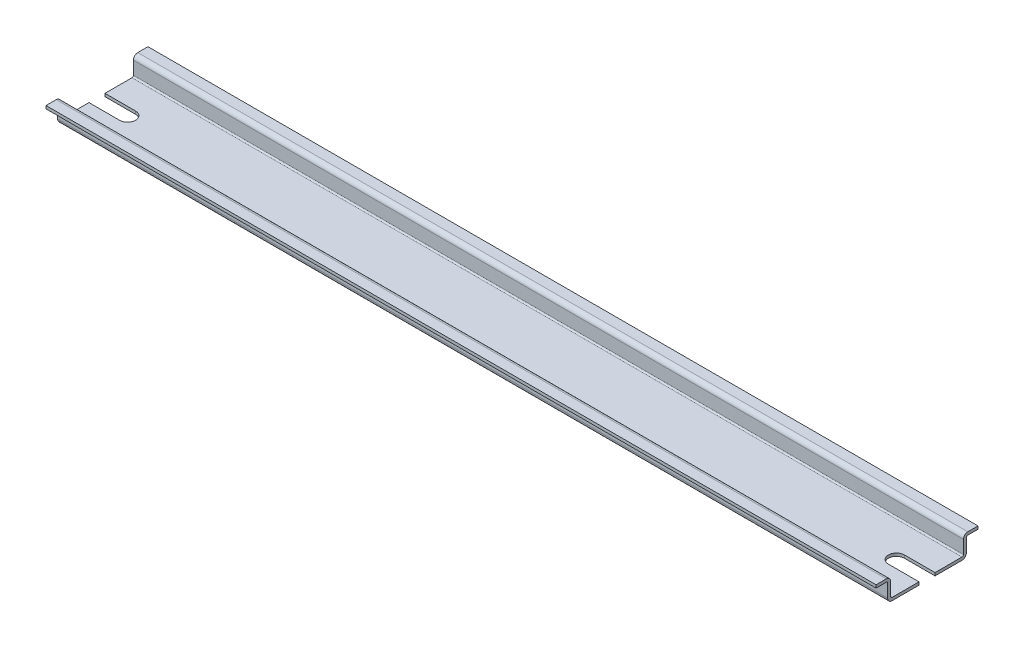
ISO-10303-21;
HEADER;
FILE_DESCRIPTION(('STEP AP214'),'2;1');
FILE_NAME('part.step','',(''),(''),'','','');
FILE_SCHEMA(('AUTOMOTIVE_DESIGN { 1 0 10303 214 1 1 1 1 }'));
ENDSEC;
DATA;
#1=APPLICATION_CONTEXT('core data for automotive mechanical design processes');
#2=APPLICATION_PROTOCOL_DEFINITION('international standard','automotive_design',2000,#1);
#3=PRODUCT_CONTEXT('',#1,'mechanical');
#4=PRODUCT('Part','Part','',(#3));
#5=PRODUCT_RELATED_PRODUCT_CATEGORY('part','',(#4));
#6=PRODUCT_DEFINITION_FORMATION('','',#4);
#7=PRODUCT_DEFINITION_CONTEXT('part definition',#1,'design');
#8=PRODUCT_DEFINITION('design','',#6,#7);
#9=PRODUCT_DEFINITION_SHAPE('','',#8);
#10=(LENGTH_UNIT() NAMED_UNIT(*) SI_UNIT(.MILLI.,.METRE.));
#11=(NAMED_UNIT(*) PLANE_ANGLE_UNIT() SI_UNIT($,.RADIAN.));
#12=(NAMED_UNIT(*) SI_UNIT($,.STERADIAN.) SOLID_ANGLE_UNIT());
#13=UNCERTAINTY_MEASURE_WITH_UNIT(LENGTH_MEASURE(1.E-05),#10,'distance_accuracy_value','');
#14=(GEOMETRIC_REPRESENTATION_CONTEXT(3) GLOBAL_UNCERTAINTY_ASSIGNED_CONTEXT((#13)) GLOBAL_UNIT_ASSIGNED_CONTEXT((#10,
#11,#12)) REPRESENTATION_CONTEXT('',''));
#15=CARTESIAN_POINT('',(0.,0.,0.));
#16=DIRECTION('',(0.,0.,1.));
#17=DIRECTION('',(1.,0.,0.));
#18=AXIS2_PLACEMENT_3D('',#15,#16,#17);
#19=CARTESIAN_POINT('',(-142.5,7.5,17.5));
#20=DIRECTION('',(0.,0.,1.));
#21=DIRECTION('',(1.,0.,0.));
#22=AXIS2_PLACEMENT_3D('',#19,#20,#21);
#23=PLANE('',#22);
#24=DIRECTION('',(1.,0.,0.));
#25=VECTOR('',#24,1.);
#26=CARTESIAN_POINT('',(-142.5,7.5,17.5));
#27=LINE('',#26,#25);
#28=CARTESIAN_POINT('',(-142.5,7.5,17.5));
#29=VERTEX_POINT('',#28);
#30=CARTESIAN_POINT('',(142.5,7.5,17.5));
#31=VERTEX_POINT('',#30);
#32=EDGE_CURVE('E392',#29,#31,#27,.T.);
#33=ORIENTED_EDGE('',*,*,#32,.F.);
#34=DIRECTION('',(0.,1.,0.));
#35=VECTOR('',#34,1.);
#36=CARTESIAN_POINT('',(-142.5,7.5,17.5));
#37=LINE('',#36,#35);
#38=CARTESIAN_POINT('',(-142.5,6.5,17.5));
#39=VERTEX_POINT('',#38);
#40=EDGE_CURVE('E165',#29,#39,#37,.F.);
#41=ORIENTED_EDGE('',*,*,#40,.T.);
#42=DIRECTION('',(1.,0.,0.));
#43=VECTOR('',#42,1.);
#44=CARTESIAN_POINT('',(-142.5,6.5,17.5));
#45=LINE('',#44,#43);
#46=CARTESIAN_POINT('',(142.5,6.5,17.5));
#47=VERTEX_POINT('',#46);
#48=EDGE_CURVE('E382',#47,#39,#45,.F.);
#49=ORIENTED_EDGE('',*,*,#48,.F.);
#50=DIRECTION('',(0.,1.,0.));
#51=VECTOR('',#50,1.);
#52=CARTESIAN_POINT('',(142.5,7.5,17.5));
#53=LINE('',#52,#51);
#54=EDGE_CURVE('E412',#47,#31,#53,.T.);
#55=ORIENTED_EDGE('',*,*,#54,.T.);
#56=EDGE_LOOP('',(#33,#41,#49,#55));
#57=FACE_BOUND('',#56,.T.);
#58=ADVANCED_FACE('F16',(#57),#23,.T.);
#59=CARTESIAN_POINT('',(-142.5,6.,14.));
#60=DIRECTION('',(-1.,0.,0.));
#61=DIRECTION('',(0.,0.,1.));
#62=AXIS2_PLACEMENT_3D('',#59,#60,#61);
#63=CYLINDRICAL_SURFACE('',#62,0.5);
#64=CARTESIAN_POINT('',(142.5,6.,14.));
#65=DIRECTION('',(-1.,0.,0.));
#66=DIRECTION('',(0.,0.,1.));
#67=AXIS2_PLACEMENT_3D('',#64,#65,#66);
#68=CIRCLE('',#67,0.5);
#69=CARTESIAN_POINT('',(142.5,6.5,14.));
#70=VERTEX_POINT('',#69);
#71=CARTESIAN_POINT('',(142.5,6.,13.5));
#72=VERTEX_POINT('',#71);
#73=EDGE_CURVE('E454',#70,#72,#68,.T.);
#74=ORIENTED_EDGE('',*,*,#73,.F.);
#75=DIRECTION('',(1.,0.,0.));
#76=VECTOR('',#75,1.);
#77=CARTESIAN_POINT('',(-142.5,6.5,14.));
#78=LINE('',#77,#76);
#79=CARTESIAN_POINT('',(-142.5,6.5,14.));
#80=VERTEX_POINT('',#79);
#81=EDGE_CURVE('E383',#80,#70,#78,.T.);
#82=ORIENTED_EDGE('',*,*,#81,.F.);
#83=CARTESIAN_POINT('',(-142.5,6.,14.));
#84=DIRECTION('',(-1.,0.,0.));
#85=DIRECTION('',(0.,0.,1.));
#86=AXIS2_PLACEMENT_3D('',#83,#84,#85);
#87=CIRCLE('',#86,0.5);
#88=CARTESIAN_POINT('',(-142.5,6.,13.5));
#89=VERTEX_POINT('',#88);
#90=EDGE_CURVE('E19',#89,#80,#87,.F.);
#91=ORIENTED_EDGE('',*,*,#90,.F.);
#92=DIRECTION('',(1.,0.,0.));
#93=VECTOR('',#92,1.);
#94=CARTESIAN_POINT('',(-142.5,6.,13.5));
#95=LINE('',#94,#93);
#96=EDGE_CURVE('E380',#72,#89,#95,.F.);
#97=ORIENTED_EDGE('',*,*,#96,.F.);
#98=EDGE_LOOP('',(#74,#82,#91,#97));
#99=FACE_BOUND('',#98,.T.);
#100=ADVANCED_FACE('F459',(#99),#63,.F.);
#101=CARTESIAN_POINT('',(-142.5,6.,-14.));
#102=DIRECTION('',(-1.,0.,0.));
#103=DIRECTION('',(0.,0.,1.));
#104=AXIS2_PLACEMENT_3D('',#101,#102,#103);
#105=CYLINDRICAL_SURFACE('',#104,0.5);
#106=CARTESIAN_POINT('',(142.5,6.,-14.));
#107=DIRECTION('',(-1.,0.,0.));
#108=DIRECTION('',(0.,0.,1.));
#109=AXIS2_PLACEMENT_3D('',#106,#107,#108);
#110=CIRCLE('',#109,0.5);
#111=CARTESIAN_POINT('',(142.5,6.,-13.5));
#112=VERTEX_POINT('',#111);
#113=CARTESIAN_POINT('',(142.5,6.5,-14.));
#114=VERTEX_POINT('',#113);
#115=EDGE_CURVE('E227',#112,#114,#110,.T.);
#116=ORIENTED_EDGE('',*,*,#115,.F.);
#117=DIRECTION('',(-1.,0.,0.));
#118=VECTOR('',#117,1.);
#119=CARTESIAN_POINT('',(-142.5,6.,-13.5));
#120=LINE('',#119,#118);
#121=CARTESIAN_POINT('',(-142.5,6.,-13.5));
#122=VERTEX_POINT('',#121);
#123=EDGE_CURVE('E362',#122,#112,#120,.F.);
#124=ORIENTED_EDGE('',*,*,#123,.F.);
#125=CARTESIAN_POINT('',(-142.5,6.,-14.));
#126=DIRECTION('',(-1.,0.,0.));
#127=DIRECTION('',(0.,0.,1.));
#128=AXIS2_PLACEMENT_3D('',#125,#126,#127);
#129=CIRCLE('',#128,0.5);
#130=CARTESIAN_POINT('',(-142.5,6.5,-14.));
#131=VERTEX_POINT('',#130);
#132=EDGE_CURVE('E453',#131,#122,#129,.F.);
#133=ORIENTED_EDGE('',*,*,#132,.F.);
#134=DIRECTION('',(1.,0.,0.));
#135=VECTOR('',#134,1.);
#136=CARTESIAN_POINT('',(-142.5,6.5,-14.));
#137=LINE('',#136,#135);
#138=EDGE_CURVE('E235',#114,#131,#137,.F.);
#139=ORIENTED_EDGE('',*,*,#138,.F.);
#140=EDGE_LOOP('',(#116,#124,#133,#139));
#141=FACE_BOUND('',#140,.T.);
#142=ADVANCED_FACE('F575',(#141),#105,.F.);
#143=CARTESIAN_POINT('',(-142.5,6.5,-17.5));
#144=DIRECTION('',(0.,0.,-1.));
#145=DIRECTION('',(-1.,0.,0.));
#146=AXIS2_PLACEMENT_3D('',#143,#144,#145);
#147=PLANE('',#146);
#148=DIRECTION('',(1.,0.,0.));
#149=VECTOR('',#148,1.);
#150=CARTESIAN_POINT('',(-142.5,6.5,-17.5));
#151=LINE('',#150,#149);
#152=CARTESIAN_POINT('',(-142.5,6.5,-17.5));
#153=VERTEX_POINT('',#152);
#154=CARTESIAN_POINT('',(142.5,6.5,-17.5));
#155=VERTEX_POINT('',#154);
#156=EDGE_CURVE('E355',#153,#155,#151,.T.);
#157=ORIENTED_EDGE('',*,*,#156,.F.);
#158=DIRECTION('',(0.,1.,0.));
#159=VECTOR('',#158,1.);
#160=CARTESIAN_POINT('',(-142.5,6.5,-17.5));
#161=LINE('',#160,#159);
#162=CARTESIAN_POINT('',(-142.5,7.5,-17.5));
#163=VERTEX_POINT('',#162);
#164=EDGE_CURVE('E226',#153,#163,#161,.T.);
#165=ORIENTED_EDGE('',*,*,#164,.T.);
#166=DIRECTION('',(1.,0.,0.));
#167=VECTOR('',#166,1.);
#168=CARTESIAN_POINT('',(-142.5,7.5,-17.5));
#169=LINE('',#168,#167);
#170=CARTESIAN_POINT('',(142.5,7.5,-17.5));
#171=VERTEX_POINT('',#170);
#172=EDGE_CURVE('E230',#171,#163,#169,.F.);
#173=ORIENTED_EDGE('',*,*,#172,.F.);
#174=DIRECTION('',(0.,1.,0.));
#175=VECTOR('',#174,1.);
#176=CARTESIAN_POINT('',(142.5,6.5,-17.5));
#177=LINE('',#176,#175);
#178=EDGE_CURVE('E214',#171,#155,#177,.F.);
#179=ORIENTED_EDGE('',*,*,#178,.T.);
#180=EDGE_LOOP('',(#157,#165,#173,#179));
#181=FACE_BOUND('',#180,.T.);
#182=ADVANCED_FACE('F231',(#181),#147,.T.);
#183=CARTESIAN_POINT('',(-142.5,1.5,12.5));
#184=DIRECTION('',(0.,0.,-1.));
#185=DIRECTION('',(-1.,0.,0.));
#186=AXIS2_PLACEMENT_3D('',#183,#184,#185);
#187=PLANE('',#186);
#188=DIRECTION('',(-1.,0.,0.));
#189=VECTOR('',#188,1.);
#190=CARTESIAN_POINT('',(-142.5,1.5,12.5));
#191=LINE('',#190,#189);
#192=CARTESIAN_POINT('',(142.5,1.5,12.5));
#193=VERTEX_POINT('',#192);
#194=CARTESIAN_POINT('',(-142.5,1.5,12.5));
#195=VERTEX_POINT('',#194);
#196=EDGE_CURVE('E400',#193,#195,#191,.T.);
#197=ORIENTED_EDGE('',*,*,#196,.T.);
#198=DIRECTION('',(0.,1.,0.));
#199=VECTOR('',#198,1.);
#200=CARTESIAN_POINT('',(-142.5,0.,12.5));
#201=LINE('',#200,#199);
#202=CARTESIAN_POINT('',(-142.5,6.,12.5));
#203=VERTEX_POINT('',#202);
#204=EDGE_CURVE('E326',#195,#203,#201,.T.);
#205=ORIENTED_EDGE('',*,*,#204,.T.);
#206=DIRECTION('',(-1.,0.,0.));
#207=VECTOR('',#206,1.);
#208=CARTESIAN_POINT('',(-142.5,6.,12.5));
#209=LINE('',#208,#207);
#210=CARTESIAN_POINT('',(142.5,6.,12.5));
#211=VERTEX_POINT('',#210);
#212=EDGE_CURVE('E395',#211,#203,#209,.T.);
#213=ORIENTED_EDGE('',*,*,#212,.F.);
#214=DIRECTION('',(0.,1.,0.));
#215=VECTOR('',#214,1.);
#216=CARTESIAN_POINT('',(142.5,0.,12.5));
#217=LINE('',#216,#215);
#218=EDGE_CURVE('E300',#193,#211,#217,.T.);
#219=ORIENTED_EDGE('',*,*,#218,.F.);
#220=EDGE_LOOP('',(#197,#205,#213,#219));
#221=FACE_BOUND('',#220,.T.);
#222=ADVANCED_FACE('F487',(#221),#187,.T.);
#223=CARTESIAN_POINT('',(-142.5,6.,14.));
#224=DIRECTION('',(-1.,0.,0.));
#225=DIRECTION('',(0.,0.,1.));
#226=AXIS2_PLACEMENT_3D('',#223,#224,#225);
#227=CYLINDRICAL_SURFACE('',#226,1.5);
#228=ORIENTED_EDGE('',*,*,#212,.T.);
#229=CARTESIAN_POINT('',(-142.5,6.,14.));
#230=DIRECTION('',(-1.,0.,0.));
#231=DIRECTION('',(0.,0.,1.));
#232=AXIS2_PLACEMENT_3D('',#229,#230,#231);
#233=CIRCLE('',#232,1.5);
#234=CARTESIAN_POINT('',(-142.5,7.5,14.));
#235=VERTEX_POINT('',#234);
#236=EDGE_CURVE('E323',#203,#235,#233,.F.);
#237=ORIENTED_EDGE('',*,*,#236,.T.);
#238=DIRECTION('',(1.,0.,0.));
#239=VECTOR('',#238,1.);
#240=CARTESIAN_POINT('',(-142.5,7.5,14.));
#241=LINE('',#240,#239);
#242=CARTESIAN_POINT('',(142.5,7.5,14.));
#243=VERTEX_POINT('',#242);
#244=EDGE_CURVE('E386',#243,#235,#241,.F.);
#245=ORIENTED_EDGE('',*,*,#244,.F.);
#246=CARTESIAN_POINT('',(142.5,6.,14.));
#247=DIRECTION('',(-1.,0.,0.));
#248=DIRECTION('',(0.,0.,1.));
#249=AXIS2_PLACEMENT_3D('',#246,#247,#248);
#250=CIRCLE('',#249,1.5);
#251=EDGE_CURVE('E297',#211,#243,#250,.F.);
#252=ORIENTED_EDGE('',*,*,#251,.F.);
#253=EDGE_LOOP('',(#228,#237,#245,#252));
#254=FACE_BOUND('',#253,.T.);
#255=ADVANCED_FACE('F491',(#254),#227,.T.);
#256=CARTESIAN_POINT('',(-142.5,7.5,14.));
#257=DIRECTION('',(0.,1.,0.));
#258=DIRECTION('',(0.,0.,1.));
#259=AXIS2_PLACEMENT_3D('',#256,#257,#258);
#260=PLANE('',#259);
#261=ORIENTED_EDGE('',*,*,#244,.T.);
#262=DIRECTION('',(0.,0.,-1.));
#263=VECTOR('',#262,1.);
#264=CARTESIAN_POINT('',(-142.5,7.5,0.));
#265=LINE('',#264,#263);
#266=EDGE_CURVE('E318',#235,#29,#265,.F.);
#267=ORIENTED_EDGE('',*,*,#266,.T.);
#268=ORIENTED_EDGE('',*,*,#32,.T.);
#269=DIRECTION('',(0.,0.,-1.));
#270=VECTOR('',#269,1.);
#271=CARTESIAN_POINT('',(142.5,7.5,0.));
#272=LINE('',#271,#270);
#273=EDGE_CURVE('E292',#243,#31,#272,.F.);
#274=ORIENTED_EDGE('',*,*,#273,.F.);
#275=EDGE_LOOP('',(#261,#267,#268,#274));
#276=FACE_BOUND('',#275,.T.);
#277=ADVANCED_FACE('F494',(#276),#260,.T.);
#278=CARTESIAN_POINT('',(-142.5,6.5,17.5));
#279=DIRECTION('',(0.,-1.,0.));
#280=DIRECTION('',(0.,0.,-1.));
#281=AXIS2_PLACEMENT_3D('',#278,#279,#280);
#282=PLANE('',#281);
#283=ORIENTED_EDGE('',*,*,#48,.T.);
#284=DIRECTION('',(0.,0.,-1.));
#285=VECTOR('',#284,1.);
#286=CARTESIAN_POINT('',(-142.5,6.5,0.));
#287=LINE('',#286,#285);
#288=EDGE_CURVE('E315',#39,#80,#287,.T.);
#289=ORIENTED_EDGE('',*,*,#288,.T.);
#290=ORIENTED_EDGE('',*,*,#81,.T.);
#291=DIRECTION('',(0.,0.,-1.));
#292=VECTOR('',#291,1.);
#293=CARTESIAN_POINT('',(142.5,6.5,0.));
#294=LINE('',#293,#292);
#295=EDGE_CURVE('E289',#47,#70,#294,.T.);
#296=ORIENTED_EDGE('',*,*,#295,.F.);
#297=EDGE_LOOP('',(#283,#289,#290,#296));
#298=FACE_BOUND('',#297,.T.);
#299=ADVANCED_FACE('F497',(#298),#282,.T.);
#300=CARTESIAN_POINT('',(-142.5,6.,13.5));
#301=DIRECTION('',(0.,0.,1.));
#302=DIRECTION('',(1.,0.,0.));
#303=AXIS2_PLACEMENT_3D('',#300,#301,#302);
#304=PLANE('',#303);
#305=ORIENTED_EDGE('',*,*,#96,.T.);
#306=DIRECTION('',(0.,1.,0.));
#307=VECTOR('',#306,1.);
#308=CARTESIAN_POINT('',(-142.5,0.,13.5));
#309=LINE('',#308,#307);
#310=CARTESIAN_POINT('',(-142.5,1.5,13.5));
#311=VERTEX_POINT('',#310);
#312=EDGE_CURVE('E312',#89,#311,#309,.F.);
#313=ORIENTED_EDGE('',*,*,#312,.T.);
#314=DIRECTION('',(-1.,0.,0.));
#315=VECTOR('',#314,1.);
#316=CARTESIAN_POINT('',(-142.5,1.5,13.5));
#317=LINE('',#316,#315);
#318=CARTESIAN_POINT('',(142.5,1.5,13.5));
#319=VERTEX_POINT('',#318);
#320=EDGE_CURVE('E377',#319,#311,#317,.T.);
#321=ORIENTED_EDGE('',*,*,#320,.F.);
#322=DIRECTION('',(0.,1.,0.));
#323=VECTOR('',#322,1.);
#324=CARTESIAN_POINT('',(142.5,0.,13.5));
#325=LINE('',#324,#323);
#326=EDGE_CURVE('E286',#72,#319,#325,.F.);
#327=ORIENTED_EDGE('',*,*,#326,.F.);
#328=EDGE_LOOP('',(#305,#313,#321,#327));
#329=FACE_BOUND('',#328,.T.);
#330=ADVANCED_FACE('F461',(#329),#304,.T.);
#331=CARTESIAN_POINT('',(-142.5,1.5,12.));
#332=DIRECTION('',(-1.,0.,0.));
#333=DIRECTION('',(0.,0.,1.));
#334=AXIS2_PLACEMENT_3D('',#331,#332,#333);
#335=CYLINDRICAL_SURFACE('',#334,1.5);
#336=ORIENTED_EDGE('',*,*,#320,.T.);
#337=CARTESIAN_POINT('',(-142.5,1.5,12.));
#338=DIRECTION('',(-1.,0.,0.));
#339=DIRECTION('',(0.,0.,1.));
#340=AXIS2_PLACEMENT_3D('',#337,#338,#339);
#341=CIRCLE('',#340,1.5);
#342=CARTESIAN_POINT('',(-142.5,0.,12.));
#343=VERTEX_POINT('',#342);
#344=EDGE_CURVE('E314',#311,#343,#341,.F.);
#345=ORIENTED_EDGE('',*,*,#344,.T.);
#346=DIRECTION('',(1.,0.,0.));
#347=VECTOR('',#346,1.);
#348=CARTESIAN_POINT('',(-142.5,0.,12.));
#349=LINE('',#348,#347);
#350=CARTESIAN_POINT('',(142.5,0.,12.));
#351=VERTEX_POINT('',#350);
#352=EDGE_CURVE('E368',#351,#343,#349,.F.);
#353=ORIENTED_EDGE('',*,*,#352,.F.);
#354=CARTESIAN_POINT('',(142.5,1.5,12.));
#355=DIRECTION('',(-1.,0.,0.));
#356=DIRECTION('',(0.,0.,1.));
#357=AXIS2_PLACEMENT_3D('',#354,#355,#356);
#358=CIRCLE('',#357,1.5);
#359=EDGE_CURVE('E283',#319,#351,#358,.F.);
#360=ORIENTED_EDGE('',*,*,#359,.F.);
#361=EDGE_LOOP('',(#336,#345,#353,#360));
#362=FACE_BOUND('',#361,.T.);
#363=ADVANCED_FACE('F465',(#362),#335,.T.);
#364=CARTESIAN_POINT('',(-142.5,0.,12.));
#365=DIRECTION('',(0.,-1.,0.));
#366=DIRECTION('',(0.,0.,-1.));
#367=AXIS2_PLACEMENT_3D('',#364,#365,#366);
#368=PLANE('',#367);
#369=ORIENTED_EDGE('',*,*,#352,.T.);
#370=DIRECTION('',(0.,0.,-1.));
#371=VECTOR('',#370,1.);
#372=CARTESIAN_POINT('',(-142.5,0.,0.));
#373=LINE('',#372,#371);
#374=CARTESIAN_POINT('',(-142.5,0.,2.75));
#375=VERTEX_POINT('',#374);
#376=EDGE_CURVE('E328',#343,#375,#373,.T.);
#377=ORIENTED_EDGE('',*,*,#376,.T.);
#378=DIRECTION('',(1.,0.,0.));
#379=VECTOR('',#378,1.);
#380=CARTESIAN_POINT('',(-132.,0.,2.75));
#381=LINE('',#380,#379);
#382=CARTESIAN_POINT('',(-132.,0.,2.75));
#383=VERTEX_POINT('',#382);
#384=EDGE_CURVE('E336',#375,#383,#381,.T.);
#385=ORIENTED_EDGE('',*,*,#384,.T.);
#386=CARTESIAN_POINT('',(-132.,0.,0.));
#387=DIRECTION('',(0.,1.,0.));
#388=DIRECTION('',(0.,0.,1.));
#389=AXIS2_PLACEMENT_3D('',#386,#387,#388);
#390=CIRCLE('',#389,2.75);
#391=CARTESIAN_POINT('',(-132.,0.,-2.75));
#392=VERTEX_POINT('',#391);
#393=EDGE_CURVE('E339',#383,#392,#390,.T.);
#394=ORIENTED_EDGE('',*,*,#393,.T.);
#395=DIRECTION('',(-1.,0.,0.));
#396=VECTOR('',#395,1.);
#397=CARTESIAN_POINT('',(-142.5,0.,-2.75));
#398=LINE('',#397,#396);
#399=CARTESIAN_POINT('',(-142.5,0.,-2.75));
#400=VERTEX_POINT('',#399);
#401=EDGE_CURVE('E340',#392,#400,#398,.T.);
#402=ORIENTED_EDGE('',*,*,#401,.T.);
#403=DIRECTION('',(0.,0.,-1.));
#404=VECTOR('',#403,1.);
#405=CARTESIAN_POINT('',(-142.5,0.,0.));
#406=LINE('',#405,#404);
#407=CARTESIAN_POINT('',(-142.5,0.,-12.));
#408=VERTEX_POINT('',#407);
#409=EDGE_CURVE('E436',#400,#408,#406,.T.);
#410=ORIENTED_EDGE('',*,*,#409,.T.);
#411=DIRECTION('',(-1.,0.,0.));
#412=VECTOR('',#411,1.);
#413=CARTESIAN_POINT('',(-142.5,0.,-12.));
#414=LINE('',#413,#412);
#415=CARTESIAN_POINT('',(142.5,0.,-12.));
#416=VERTEX_POINT('',#415);
#417=EDGE_CURVE('E365',#416,#408,#414,.T.);
#418=ORIENTED_EDGE('',*,*,#417,.F.);
#419=DIRECTION('',(0.,0.,-1.));
#420=VECTOR('',#419,1.);
#421=CARTESIAN_POINT('',(142.5,0.,0.));
#422=LINE('',#421,#420);
#423=CARTESIAN_POINT('',(142.5,0.,-2.75));
#424=VERTEX_POINT('',#423);
#425=EDGE_CURVE('E258',#424,#416,#422,.T.);
#426=ORIENTED_EDGE('',*,*,#425,.F.);
#427=DIRECTION('',(-1.,0.,0.));
#428=VECTOR('',#427,1.);
#429=CARTESIAN_POINT('',(132.,0.,-2.75));
#430=LINE('',#429,#428);
#431=CARTESIAN_POINT('',(132.,0.,-2.75));
#432=VERTEX_POINT('',#431);
#433=EDGE_CURVE('E263',#424,#432,#430,.T.);
#434=ORIENTED_EDGE('',*,*,#433,.T.);
#435=CARTESIAN_POINT('',(132.,0.,0.));
#436=DIRECTION('',(0.,1.,0.));
#437=DIRECTION('',(0.,0.,1.));
#438=AXIS2_PLACEMENT_3D('',#435,#436,#437);
#439=CIRCLE('',#438,2.75);
#440=CARTESIAN_POINT('',(132.,0.,2.75));
#441=VERTEX_POINT('',#440);
#442=EDGE_CURVE('E266',#432,#441,#439,.T.);
#443=ORIENTED_EDGE('',*,*,#442,.T.);
#444=DIRECTION('',(1.,0.,0.));
#445=VECTOR('',#444,1.);
#446=CARTESIAN_POINT('',(142.5,0.,2.75));
#447=LINE('',#446,#445);
#448=CARTESIAN_POINT('',(142.5,0.,2.75));
#449=VERTEX_POINT('',#448);
#450=EDGE_CURVE('E270',#441,#449,#447,.T.);
#451=ORIENTED_EDGE('',*,*,#450,.T.);
#452=DIRECTION('',(0.,0.,-1.));
#453=VECTOR('',#452,1.);
#454=CARTESIAN_POINT('',(142.5,0.,0.));
#455=LINE('',#454,#453);
#456=EDGE_CURVE('E280',#351,#449,#455,.T.);
#457=ORIENTED_EDGE('',*,*,#456,.F.);
#458=EDGE_LOOP('',(#369,#377,#385,#394,#402,#410,#418,#426,#434,#443,#451,#457));
#459=FACE_BOUND('',#458,.T.);
#460=ADVANCED_FACE('F544',(#459),#368,.T.);
#461=CARTESIAN_POINT('',(-142.5,1.5,-12.));
#462=DIRECTION('',(-1.,0.,0.));
#463=DIRECTION('',(0.,0.,1.));
#464=AXIS2_PLACEMENT_3D('',#461,#462,#463);
#465=CYLINDRICAL_SURFACE('',#464,1.5);
#466=ORIENTED_EDGE('',*,*,#417,.T.);
#467=CARTESIAN_POINT('',(-142.5,1.5,-12.));
#468=DIRECTION('',(-1.,0.,0.));
#469=DIRECTION('',(0.,0.,1.));
#470=AXIS2_PLACEMENT_3D('',#467,#468,#469);
#471=CIRCLE('',#470,1.5);
#472=CARTESIAN_POINT('',(-142.5,1.5,-13.5));
#473=VERTEX_POINT('',#472);
#474=EDGE_CURVE('E433',#408,#473,#471,.F.);
#475=ORIENTED_EDGE('',*,*,#474,.T.);
#476=DIRECTION('',(-1.,0.,0.));
#477=VECTOR('',#476,1.);
#478=CARTESIAN_POINT('',(-142.5,1.5,-13.5));
#479=LINE('',#478,#477);
#480=CARTESIAN_POINT('',(142.5,1.5,-13.5));
#481=VERTEX_POINT('',#480);
#482=EDGE_CURVE('E357',#481,#473,#479,.T.);
#483=ORIENTED_EDGE('',*,*,#482,.F.);
#484=CARTESIAN_POINT('',(142.5,1.5,-12.));
#485=DIRECTION('',(-1.,0.,0.));
#486=DIRECTION('',(0.,0.,1.));
#487=AXIS2_PLACEMENT_3D('',#484,#485,#486);
#488=CIRCLE('',#487,1.5);
#489=EDGE_CURVE('E255',#416,#481,#488,.F.);
#490=ORIENTED_EDGE('',*,*,#489,.F.);
#491=EDGE_LOOP('',(#466,#475,#483,#490));
#492=FACE_BOUND('',#491,.T.);
#493=ADVANCED_FACE('F583',(#492),#465,.T.);
#494=CARTESIAN_POINT('',(-142.5,1.5,-13.5));
#495=DIRECTION('',(0.,0.,-1.));
#496=DIRECTION('',(-1.,0.,0.));
#497=AXIS2_PLACEMENT_3D('',#494,#495,#496);
#498=PLANE('',#497);
#499=ORIENTED_EDGE('',*,*,#482,.T.);
#500=DIRECTION('',(0.,1.,0.));
#501=VECTOR('',#500,1.);
#502=CARTESIAN_POINT('',(-142.5,0.,-13.5));
#503=LINE('',#502,#501);
#504=EDGE_CURVE('E435',#473,#122,#503,.T.);
#505=ORIENTED_EDGE('',*,*,#504,.T.);
#506=ORIENTED_EDGE('',*,*,#123,.T.);
#507=DIRECTION('',(0.,1.,0.));
#508=VECTOR('',#507,1.);
#509=CARTESIAN_POINT('',(142.5,0.,-13.5));
#510=LINE('',#509,#508);
#511=EDGE_CURVE('E244',#481,#112,#510,.T.);
#512=ORIENTED_EDGE('',*,*,#511,.F.);
#513=EDGE_LOOP('',(#499,#505,#506,#512));
#514=FACE_BOUND('',#513,.T.);
#515=ADVANCED_FACE('F580',(#514),#498,.T.);
#516=CARTESIAN_POINT('',(-142.5,6.5,-14.));
#517=DIRECTION('',(0.,-1.,0.));
#518=DIRECTION('',(0.,0.,-1.));
#519=AXIS2_PLACEMENT_3D('',#516,#517,#518);
#520=PLANE('',#519);
#521=ORIENTED_EDGE('',*,*,#138,.T.);
#522=DIRECTION('',(0.,0.,-1.));
#523=VECTOR('',#522,1.);
#524=CARTESIAN_POINT('',(-142.5,6.5,0.));
#525=LINE('',#524,#523);
#526=EDGE_CURVE('E514',#131,#153,#525,.T.);
#527=ORIENTED_EDGE('',*,*,#526,.T.);
#528=ORIENTED_EDGE('',*,*,#156,.T.);
#529=DIRECTION('',(0.,0.,-1.));
#530=VECTOR('',#529,1.);
#531=CARTESIAN_POINT('',(142.5,6.5,0.));
#532=LINE('',#531,#530);
#533=EDGE_CURVE('E225',#114,#155,#532,.T.);
#534=ORIENTED_EDGE('',*,*,#533,.F.);
#535=EDGE_LOOP('',(#521,#527,#528,#534));
#536=FACE_BOUND('',#535,.T.);
#537=ADVANCED_FACE('F572',(#536),#520,.T.);
#538=CARTESIAN_POINT('',(-142.5,7.5,-17.5));
#539=DIRECTION('',(0.,1.,0.));
#540=DIRECTION('',(0.,0.,1.));
#541=AXIS2_PLACEMENT_3D('',#538,#539,#540);
#542=PLANE('',#541);
#543=ORIENTED_EDGE('',*,*,#172,.T.);
#544=DIRECTION('',(0.,0.,-1.));
#545=VECTOR('',#544,1.);
#546=CARTESIAN_POINT('',(-142.5,7.5,0.));
#547=LINE('',#546,#545);
#548=CARTESIAN_POINT('',(-142.5,7.5,-14.));
#549=VERTEX_POINT('',#548);
#550=EDGE_CURVE('E432',#163,#549,#547,.F.);
#551=ORIENTED_EDGE('',*,*,#550,.T.);
#552=DIRECTION('',(-1.,0.,0.));
#553=VECTOR('',#552,1.);
#554=CARTESIAN_POINT('',(-142.5,7.5,-14.));
#555=LINE('',#554,#553);
#556=CARTESIAN_POINT('',(142.5,7.5,-14.));
#557=VERTEX_POINT('',#556);
#558=EDGE_CURVE('E234',#557,#549,#555,.T.);
#559=ORIENTED_EDGE('',*,*,#558,.F.);
#560=DIRECTION('',(0.,0.,-1.));
#561=VECTOR('',#560,1.);
#562=CARTESIAN_POINT('',(142.5,7.5,0.));
#563=LINE('',#562,#561);
#564=EDGE_CURVE('E223',#171,#557,#563,.F.);
#565=ORIENTED_EDGE('',*,*,#564,.F.);
#566=EDGE_LOOP('',(#543,#551,#559,#565));
#567=FACE_BOUND('',#566,.T.);
#568=ADVANCED_FACE('F237',(#567),#542,.T.);
#569=CARTESIAN_POINT('',(-142.5,6.,-14.));
#570=DIRECTION('',(-1.,0.,0.));
#571=DIRECTION('',(0.,0.,1.));
#572=AXIS2_PLACEMENT_3D('',#569,#570,#571);
#573=CYLINDRICAL_SURFACE('',#572,1.5);
#574=ORIENTED_EDGE('',*,*,#558,.T.);
#575=CARTESIAN_POINT('',(-142.5,6.,-14.));
#576=DIRECTION('',(-1.,0.,0.));
#577=DIRECTION('',(0.,0.,1.));
#578=AXIS2_PLACEMENT_3D('',#575,#576,#577);
#579=CIRCLE('',#578,1.5);
#580=CARTESIAN_POINT('',(-142.5,6.,-12.5));
#581=VERTEX_POINT('',#580);
#582=EDGE_CURVE('E430',#549,#581,#579,.F.);
#583=ORIENTED_EDGE('',*,*,#582,.T.);
#584=DIRECTION('',(1.,0.,0.));
#585=VECTOR('',#584,1.);
#586=CARTESIAN_POINT('',(-142.5,6.,-12.5));
#587=LINE('',#586,#585);
#588=CARTESIAN_POINT('',(142.5,6.,-12.5));
#589=VERTEX_POINT('',#588);
#590=EDGE_CURVE('E342',#589,#581,#587,.F.);
#591=ORIENTED_EDGE('',*,*,#590,.F.);
#592=CARTESIAN_POINT('',(142.5,6.,-14.));
#593=DIRECTION('',(-1.,0.,0.));
#594=DIRECTION('',(0.,0.,1.));
#595=AXIS2_PLACEMENT_3D('',#592,#593,#594);
#596=CIRCLE('',#595,1.5);
#597=EDGE_CURVE('E240',#557,#589,#596,.F.);
#598=ORIENTED_EDGE('',*,*,#597,.F.);
#599=EDGE_LOOP('',(#574,#583,#591,#598));
#600=FACE_BOUND('',#599,.T.);
#601=ADVANCED_FACE('F569',(#600),#573,.T.);
#602=CARTESIAN_POINT('',(-142.5,6.,-12.5));
#603=DIRECTION('',(0.,0.,1.));
#604=DIRECTION('',(1.,0.,0.));
#605=AXIS2_PLACEMENT_3D('',#602,#603,#604);
#606=PLANE('',#605);
#607=ORIENTED_EDGE('',*,*,#590,.T.);
#608=DIRECTION('',(0.,1.,0.));
#609=VECTOR('',#608,1.);
#610=CARTESIAN_POINT('',(-142.5,0.,-12.5));
#611=LINE('',#610,#609);
#612=CARTESIAN_POINT('',(-142.5,1.5,-12.5));
#613=VERTEX_POINT('',#612);
#614=EDGE_CURVE('E429',#581,#613,#611,.F.);
#615=ORIENTED_EDGE('',*,*,#614,.T.);
#616=DIRECTION('',(-1.,0.,0.));
#617=VECTOR('',#616,1.);
#618=CARTESIAN_POINT('',(-142.5,1.5,-12.5));
#619=LINE('',#618,#617);
#620=CARTESIAN_POINT('',(142.5,1.5,-12.5));
#621=VERTEX_POINT('',#620);
#622=EDGE_CURVE('E345',#613,#621,#619,.F.);
#623=ORIENTED_EDGE('',*,*,#622,.T.);
#624=DIRECTION('',(0.,1.,0.));
#625=VECTOR('',#624,1.);
#626=CARTESIAN_POINT('',(142.5,0.,-12.5));
#627=LINE('',#626,#625);
#628=EDGE_CURVE('E242',#589,#621,#627,.F.);
#629=ORIENTED_EDGE('',*,*,#628,.F.);
#630=EDGE_LOOP('',(#607,#615,#623,#629));
#631=FACE_BOUND('',#630,.T.);
#632=ADVANCED_FACE('F557',(#631),#606,.T.);
#633=CARTESIAN_POINT('',(-142.5,0.,-2.75));
#634=DIRECTION('',(0.,0.,-1.));
#635=DIRECTION('',(-1.,0.,0.));
#636=AXIS2_PLACEMENT_3D('',#633,#634,#635);
#637=PLANE('',#636);
#638=DIRECTION('',(1.,0.,0.));
#639=VECTOR('',#638,1.);
#640=CARTESIAN_POINT('',(-142.5,1.,-2.75));
#641=LINE('',#640,#639);
#642=CARTESIAN_POINT('',(-142.5,1.,-2.75));
#643=VERTEX_POINT('',#642);
#644=CARTESIAN_POINT('',(-132.,1.,-2.75));
#645=VERTEX_POINT('',#644);
#646=EDGE_CURVE('E426',#643,#645,#641,.T.);
#647=ORIENTED_EDGE('',*,*,#646,.F.);
#648=DIRECTION('',(0.,1.,0.));
#649=VECTOR('',#648,1.);
#650=CARTESIAN_POINT('',(-142.5,0.,-2.75));
#651=LINE('',#650,#649);
#652=EDGE_CURVE('E428',#643,#400,#651,.F.);
#653=ORIENTED_EDGE('',*,*,#652,.T.);
#654=ORIENTED_EDGE('',*,*,#401,.F.);
#655=DIRECTION('',(0.,1.,0.));
#656=VECTOR('',#655,1.);
#657=CARTESIAN_POINT('',(-132.,0.,-2.75));
#658=LINE('',#657,#656);
#659=EDGE_CURVE('E337',#392,#645,#658,.T.);
#660=ORIENTED_EDGE('',*,*,#659,.T.);
#661=EDGE_LOOP('',(#647,#653,#654,#660));
#662=FACE_BOUND('',#661,.T.);
#663=ADVANCED_FACE('F625',(#662),#637,.F.);
#664=CARTESIAN_POINT('',(-132.,0.,0.));
#665=DIRECTION('',(0.,1.,0.));
#666=DIRECTION('',(0.,0.,1.));
#667=AXIS2_PLACEMENT_3D('',#664,#665,#666);
#668=CYLINDRICAL_SURFACE('',#667,2.75);
#669=CARTESIAN_POINT('',(-132.,1.,0.));
#670=DIRECTION('',(0.,1.,0.));
#671=DIRECTION('',(0.,0.,1.));
#672=AXIS2_PLACEMENT_3D('',#669,#670,#671);
#673=CIRCLE('',#672,2.75);
#674=CARTESIAN_POINT('',(-132.,1.,2.75));
#675=VERTEX_POINT('',#674);
#676=EDGE_CURVE('E423',#645,#675,#673,.F.);
#677=ORIENTED_EDGE('',*,*,#676,.F.);
#678=ORIENTED_EDGE('',*,*,#659,.F.);
#679=ORIENTED_EDGE('',*,*,#393,.F.);
#680=DIRECTION('',(0.,1.,0.));
#681=VECTOR('',#680,1.);
#682=CARTESIAN_POINT('',(-132.,0.,2.75));
#683=LINE('',#682,#681);
#684=EDGE_CURVE('E190',#383,#675,#683,.T.);
#685=ORIENTED_EDGE('',*,*,#684,.T.);
#686=EDGE_LOOP('',(#677,#678,#679,#685));
#687=FACE_BOUND('',#686,.T.);
#688=ADVANCED_FACE('F622',(#687),#668,.F.);
#689=CARTESIAN_POINT('',(-132.,0.,2.75));
#690=DIRECTION('',(0.,0.,1.));
#691=DIRECTION('',(1.,0.,0.));
#692=AXIS2_PLACEMENT_3D('',#689,#690,#691);
#693=PLANE('',#692);
#694=DIRECTION('',(1.,0.,0.));
#695=VECTOR('',#694,1.);
#696=CARTESIAN_POINT('',(-142.5,1.,2.75));
#697=LINE('',#696,#695);
#698=CARTESIAN_POINT('',(-142.5,1.,2.75));
#699=VERTEX_POINT('',#698);
#700=EDGE_CURVE('E309',#675,#699,#697,.F.);
#701=ORIENTED_EDGE('',*,*,#700,.F.);
#702=ORIENTED_EDGE('',*,*,#684,.F.);
#703=ORIENTED_EDGE('',*,*,#384,.F.);
#704=DIRECTION('',(0.,1.,0.));
#705=VECTOR('',#704,1.);
#706=CARTESIAN_POINT('',(-142.5,0.,2.75));
#707=LINE('',#706,#705);
#708=EDGE_CURVE('E197',#375,#699,#707,.T.);
#709=ORIENTED_EDGE('',*,*,#708,.T.);
#710=EDGE_LOOP('',(#701,#702,#703,#709));
#711=FACE_BOUND('',#710,.T.);
#712=ADVANCED_FACE('F619',(#711),#693,.F.);
#713=CARTESIAN_POINT('',(-142.5,0.,0.));
#714=DIRECTION('',(1.,0.,0.));
#715=DIRECTION('',(0.,0.,-1.));
#716=AXIS2_PLACEMENT_3D('',#713,#714,#715);
#717=PLANE('',#716);
#718=ORIENTED_EDGE('',*,*,#312,.F.);
#719=ORIENTED_EDGE('',*,*,#90,.T.);
#720=ORIENTED_EDGE('',*,*,#288,.F.);
#721=ORIENTED_EDGE('',*,*,#40,.F.);
#722=ORIENTED_EDGE('',*,*,#266,.F.);
#723=ORIENTED_EDGE('',*,*,#236,.F.);
#724=ORIENTED_EDGE('',*,*,#204,.F.);
#725=CARTESIAN_POINT('',(-142.5,1.5,12.));
#726=DIRECTION('',(-1.,0.,0.));
#727=DIRECTION('',(0.,0.,1.));
#728=AXIS2_PLACEMENT_3D('',#725,#726,#727);
#729=CIRCLE('',#728,0.5);
#730=CARTESIAN_POINT('',(-142.5,1.,12.));
#731=VERTEX_POINT('',#730);
#732=EDGE_CURVE('E403',#195,#731,#729,.F.);
#733=ORIENTED_EDGE('',*,*,#732,.T.);
#734=DIRECTION('',(0.,0.,1.));
#735=VECTOR('',#734,1.);
#736=CARTESIAN_POINT('',(-142.5,1.,-12.));
#737=LINE('',#736,#735);
#738=EDGE_CURVE('E306',#699,#731,#737,.T.);
#739=ORIENTED_EDGE('',*,*,#738,.F.);
#740=ORIENTED_EDGE('',*,*,#708,.F.);
#741=ORIENTED_EDGE('',*,*,#376,.F.);
#742=ORIENTED_EDGE('',*,*,#344,.F.);
#743=EDGE_LOOP('',(#718,#719,#720,#721,#722,#723,#724,#733,#739,#740,#741,#742));
#744=FACE_BOUND('',#743,.T.);
#745=ADVANCED_FACE('F498',(#744),#717,.F.);
#746=CARTESIAN_POINT('',(-142.5,1.5,12.));
#747=DIRECTION('',(-1.,0.,0.));
#748=DIRECTION('',(0.,0.,1.));
#749=AXIS2_PLACEMENT_3D('',#746,#747,#748);
#750=CYLINDRICAL_SURFACE('',#749,0.5);
#751=CARTESIAN_POINT('',(142.5,1.5,12.));
#752=DIRECTION('',(-1.,0.,0.));
#753=DIRECTION('',(0.,0.,1.));
#754=AXIS2_PLACEMENT_3D('',#751,#752,#753);
#755=CIRCLE('',#754,0.5);
#756=CARTESIAN_POINT('',(142.5,1.,12.));
#757=VERTEX_POINT('',#756);
#758=EDGE_CURVE('E303',#757,#193,#755,.T.);
#759=ORIENTED_EDGE('',*,*,#758,.F.);
#760=DIRECTION('',(1.,0.,0.));
#761=VECTOR('',#760,1.);
#762=CARTESIAN_POINT('',(-142.5,1.,12.));
#763=LINE('',#762,#761);
#764=EDGE_CURVE('E277',#731,#757,#763,.T.);
#765=ORIENTED_EDGE('',*,*,#764,.F.);
#766=ORIENTED_EDGE('',*,*,#732,.F.);
#767=ORIENTED_EDGE('',*,*,#196,.F.);
#768=EDGE_LOOP('',(#759,#765,#766,#767));
#769=FACE_BOUND('',#768,.T.);
#770=ADVANCED_FACE('F484',(#769),#750,.F.);
#771=CARTESIAN_POINT('',(142.5,0.,0.));
#772=DIRECTION('',(1.,0.,0.));
#773=DIRECTION('',(0.,0.,-1.));
#774=AXIS2_PLACEMENT_3D('',#771,#772,#773);
#775=PLANE('',#774);
#776=ORIENTED_EDGE('',*,*,#359,.T.);
#777=ORIENTED_EDGE('',*,*,#456,.T.);
#778=DIRECTION('',(0.,1.,0.));
#779=VECTOR('',#778,1.);
#780=CARTESIAN_POINT('',(142.5,0.,2.75));
#781=LINE('',#780,#779);
#782=CARTESIAN_POINT('',(142.5,1.,2.75));
#783=VERTEX_POINT('',#782);
#784=EDGE_CURVE('E267',#449,#783,#781,.T.);
#785=ORIENTED_EDGE('',*,*,#784,.T.);
#786=DIRECTION('',(0.,0.,1.));
#787=VECTOR('',#786,1.);
#788=CARTESIAN_POINT('',(142.5,1.,-12.));
#789=LINE('',#788,#787);
#790=EDGE_CURVE('E273',#757,#783,#789,.F.);
#791=ORIENTED_EDGE('',*,*,#790,.F.);
#792=ORIENTED_EDGE('',*,*,#758,.T.);
#793=ORIENTED_EDGE('',*,*,#218,.T.);
#794=ORIENTED_EDGE('',*,*,#251,.T.);
#795=ORIENTED_EDGE('',*,*,#273,.T.);
#796=ORIENTED_EDGE('',*,*,#54,.F.);
#797=ORIENTED_EDGE('',*,*,#295,.T.);
#798=ORIENTED_EDGE('',*,*,#73,.T.);
#799=ORIENTED_EDGE('',*,*,#326,.T.);
#800=EDGE_LOOP('',(#776,#777,#785,#791,#792,#793,#794,#795,#796,#797,#798,#799));
#801=FACE_BOUND('',#800,.T.);
#802=ADVANCED_FACE('F456',(#801),#775,.T.);
#803=CARTESIAN_POINT('',(142.5,0.,2.75));
#804=DIRECTION('',(0.,0.,1.));
#805=DIRECTION('',(1.,0.,0.));
#806=AXIS2_PLACEMENT_3D('',#803,#804,#805);
#807=PLANE('',#806);
#808=DIRECTION('',(1.,0.,0.));
#809=VECTOR('',#808,1.);
#810=CARTESIAN_POINT('',(-142.5,1.,2.75));
#811=LINE('',#810,#809);
#812=CARTESIAN_POINT('',(132.,1.,2.75));
#813=VERTEX_POINT('',#812);
#814=EDGE_CURVE('E276',#783,#813,#811,.F.);
#815=ORIENTED_EDGE('',*,*,#814,.F.);
#816=ORIENTED_EDGE('',*,*,#784,.F.);
#817=ORIENTED_EDGE('',*,*,#450,.F.);
#818=DIRECTION('',(0.,1.,0.));
#819=VECTOR('',#818,1.);
#820=CARTESIAN_POINT('',(132.,0.,2.75));
#821=LINE('',#820,#819);
#822=EDGE_CURVE('E264',#441,#813,#821,.T.);
#823=ORIENTED_EDGE('',*,*,#822,.T.);
#824=EDGE_LOOP('',(#815,#816,#817,#823));
#825=FACE_BOUND('',#824,.T.);
#826=ADVANCED_FACE('F473',(#825),#807,.F.);
#827=CARTESIAN_POINT('',(132.,0.,0.));
#828=DIRECTION('',(0.,1.,0.));
#829=DIRECTION('',(0.,0.,1.));
#830=AXIS2_PLACEMENT_3D('',#827,#828,#829);
#831=CYLINDRICAL_SURFACE('',#830,2.75);
#832=CARTESIAN_POINT('',(132.,1.,0.));
#833=DIRECTION('',(0.,1.,0.));
#834=DIRECTION('',(0.,0.,1.));
#835=AXIS2_PLACEMENT_3D('',#832,#833,#834);
#836=CIRCLE('',#835,2.75);
#837=CARTESIAN_POINT('',(132.,1.,-2.75));
#838=VERTEX_POINT('',#837);
#839=EDGE_CURVE('E419',#813,#838,#836,.F.);
#840=ORIENTED_EDGE('',*,*,#839,.F.);
#841=ORIENTED_EDGE('',*,*,#822,.F.);
#842=ORIENTED_EDGE('',*,*,#442,.F.);
#843=DIRECTION('',(0.,1.,0.));
#844=VECTOR('',#843,1.);
#845=CARTESIAN_POINT('',(132.,0.,-2.75));
#846=LINE('',#845,#844);
#847=EDGE_CURVE('E261',#432,#838,#846,.T.);
#848=ORIENTED_EDGE('',*,*,#847,.T.);
#849=EDGE_LOOP('',(#840,#841,#842,#848));
#850=FACE_BOUND('',#849,.T.);
#851=ADVANCED_FACE('F607',(#850),#831,.F.);
#852=CARTESIAN_POINT('',(132.,0.,-2.75));
#853=DIRECTION('',(0.,0.,-1.));
#854=DIRECTION('',(-1.,0.,0.));
#855=AXIS2_PLACEMENT_3D('',#852,#853,#854);
#856=PLANE('',#855);
#857=DIRECTION('',(1.,0.,0.));
#858=VECTOR('',#857,1.);
#859=CARTESIAN_POINT('',(-142.5,1.,-2.75));
#860=LINE('',#859,#858);
#861=CARTESIAN_POINT('',(142.5,1.,-2.75));
#862=VERTEX_POINT('',#861);
#863=EDGE_CURVE('E422',#838,#862,#860,.T.);
#864=ORIENTED_EDGE('',*,*,#863,.F.);
#865=ORIENTED_EDGE('',*,*,#847,.F.);
#866=ORIENTED_EDGE('',*,*,#433,.F.);
#867=DIRECTION('',(0.,1.,0.));
#868=VECTOR('',#867,1.);
#869=CARTESIAN_POINT('',(142.5,0.,-2.75));
#870=LINE('',#869,#868);
#871=EDGE_CURVE('E256',#862,#424,#870,.F.);
#872=ORIENTED_EDGE('',*,*,#871,.F.);
#873=EDGE_LOOP('',(#864,#865,#866,#872));
#874=FACE_BOUND('',#873,.T.);
#875=ADVANCED_FACE('F604',(#874),#856,.F.);
#876=CARTESIAN_POINT('',(142.5,0.,0.));
#877=DIRECTION('',(1.,0.,0.));
#878=DIRECTION('',(0.,0.,-1.));
#879=AXIS2_PLACEMENT_3D('',#876,#877,#878);
#880=PLANE('',#879);
#881=ORIENTED_EDGE('',*,*,#871,.T.);
#882=ORIENTED_EDGE('',*,*,#425,.T.);
#883=ORIENTED_EDGE('',*,*,#489,.T.);
#884=ORIENTED_EDGE('',*,*,#511,.T.);
#885=ORIENTED_EDGE('',*,*,#115,.T.);
#886=ORIENTED_EDGE('',*,*,#533,.T.);
#887=ORIENTED_EDGE('',*,*,#178,.F.);
#888=ORIENTED_EDGE('',*,*,#564,.T.);
#889=ORIENTED_EDGE('',*,*,#597,.T.);
#890=ORIENTED_EDGE('',*,*,#628,.T.);
#891=CARTESIAN_POINT('',(142.5,1.5,-12.));
#892=DIRECTION('',(-1.,0.,0.));
#893=DIRECTION('',(0.,0.,1.));
#894=AXIS2_PLACEMENT_3D('',#891,#892,#893);
#895=CIRCLE('',#894,0.5);
#896=CARTESIAN_POINT('',(142.5,1.,-12.));
#897=VERTEX_POINT('',#896);
#898=EDGE_CURVE('E347',#621,#897,#895,.T.);
#899=ORIENTED_EDGE('',*,*,#898,.T.);
#900=DIRECTION('',(0.,0.,1.));
#901=VECTOR('',#900,1.);
#902=CARTESIAN_POINT('',(142.5,1.,-12.));
#903=LINE('',#902,#901);
#904=EDGE_CURVE('E526',#862,#897,#903,.F.);
#905=ORIENTED_EDGE('',*,*,#904,.F.);
#906=EDGE_LOOP('',(#881,#882,#883,#884,#885,#886,#887,#888,#889,#890,#899,#905));
#907=FACE_BOUND('',#906,.T.);
#908=ADVANCED_FACE('F220',(#907),#880,.T.);
#909=CARTESIAN_POINT('',(-142.5,1.5,-12.));
#910=DIRECTION('',(-1.,0.,0.));
#911=DIRECTION('',(0.,0.,1.));
#912=AXIS2_PLACEMENT_3D('',#909,#910,#911);
#913=CYLINDRICAL_SURFACE('',#912,0.5);
#914=ORIENTED_EDGE('',*,*,#898,.F.);
#915=ORIENTED_EDGE('',*,*,#622,.F.);
#916=CARTESIAN_POINT('',(-142.5,1.5,-12.));
#917=DIRECTION('',(-1.,0.,0.));
#918=DIRECTION('',(0.,0.,1.));
#919=AXIS2_PLACEMENT_3D('',#916,#917,#918);
#920=CIRCLE('',#919,0.5);
#921=CARTESIAN_POINT('',(-142.5,1.,-12.));
#922=VERTEX_POINT('',#921);
#923=EDGE_CURVE('E34',#613,#922,#920,.T.);
#924=ORIENTED_EDGE('',*,*,#923,.T.);
#925=DIRECTION('',(1.,0.,0.));
#926=VECTOR('',#925,1.);
#927=CARTESIAN_POINT('',(-142.5,1.,-12.));
#928=LINE('',#927,#926);
#929=EDGE_CURVE('E25',#897,#922,#928,.F.);
#930=ORIENTED_EDGE('',*,*,#929,.F.);
#931=EDGE_LOOP('',(#914,#915,#924,#930));
#932=FACE_BOUND('',#931,.T.);
#933=ADVANCED_FACE('F563',(#932),#913,.F.);
#934=CARTESIAN_POINT('',(-142.5,0.,0.));
#935=DIRECTION('',(1.,0.,0.));
#936=DIRECTION('',(0.,0.,-1.));
#937=AXIS2_PLACEMENT_3D('',#934,#935,#936);
#938=PLANE('',#937);
#939=DIRECTION('',(0.,0.,1.));
#940=VECTOR('',#939,1.);
#941=CARTESIAN_POINT('',(-142.5,1.,-12.));
#942=LINE('',#941,#940);
#943=EDGE_CURVE('E11',#922,#643,#942,.T.);
#944=ORIENTED_EDGE('',*,*,#943,.F.);
#945=ORIENTED_EDGE('',*,*,#923,.F.);
#946=ORIENTED_EDGE('',*,*,#614,.F.);
#947=ORIENTED_EDGE('',*,*,#582,.F.);
#948=ORIENTED_EDGE('',*,*,#550,.F.);
#949=ORIENTED_EDGE('',*,*,#164,.F.);
#950=ORIENTED_EDGE('',*,*,#526,.F.);
#951=ORIENTED_EDGE('',*,*,#132,.T.);
#952=ORIENTED_EDGE('',*,*,#504,.F.);
#953=ORIENTED_EDGE('',*,*,#474,.F.);
#954=ORIENTED_EDGE('',*,*,#409,.F.);
#955=ORIENTED_EDGE('',*,*,#652,.F.);
#956=EDGE_LOOP('',(#944,#945,#946,#947,#948,#949,#950,#951,#952,#953,#954,#955));
#957=FACE_BOUND('',#956,.T.);
#958=ADVANCED_FACE('F564',(#957),#938,.F.);
#959=CARTESIAN_POINT('',(-142.5,1.,-12.));
#960=DIRECTION('',(0.,1.,0.));
#961=DIRECTION('',(0.,0.,1.));
#962=AXIS2_PLACEMENT_3D('',#959,#960,#961);
#963=PLANE('',#962);
#964=ORIENTED_EDGE('',*,*,#929,.T.);
#965=ORIENTED_EDGE('',*,*,#943,.T.);
#966=ORIENTED_EDGE('',*,*,#646,.T.);
#967=ORIENTED_EDGE('',*,*,#676,.T.);
#968=ORIENTED_EDGE('',*,*,#700,.T.);
#969=ORIENTED_EDGE('',*,*,#738,.T.);
#970=ORIENTED_EDGE('',*,*,#764,.T.);
#971=ORIENTED_EDGE('',*,*,#790,.T.);
#972=ORIENTED_EDGE('',*,*,#814,.T.);
#973=ORIENTED_EDGE('',*,*,#839,.T.);
#974=ORIENTED_EDGE('',*,*,#863,.T.);
#975=ORIENTED_EDGE('',*,*,#904,.T.);
#976=EDGE_LOOP('',(#964,#965,#966,#967,#968,#969,#970,#971,#972,#973,#974,#975));
#977=FACE_BOUND('',#976,.T.);
#978=ADVANCED_FACE('F480',(#977),#963,.T.);
#979=CLOSED_SHELL('',(#58,#100,#142,#182,#222,#255,#277,#299,#330,#363,#460,#493,#515,#537,#568,
#601,#632,#663,#688,#712,#745,#770,#802,#826,#851,#875,#908,#933,#958,#978));
#980=MANIFOLD_SOLID_BREP('B1',#979);
#981=ADVANCED_BREP_SHAPE_REPRESENTATION('',(#18,#980),#14);
#982=SHAPE_DEFINITION_REPRESENTATION(#9,#981);
ENDSEC;
END-ISO-10303-21;
